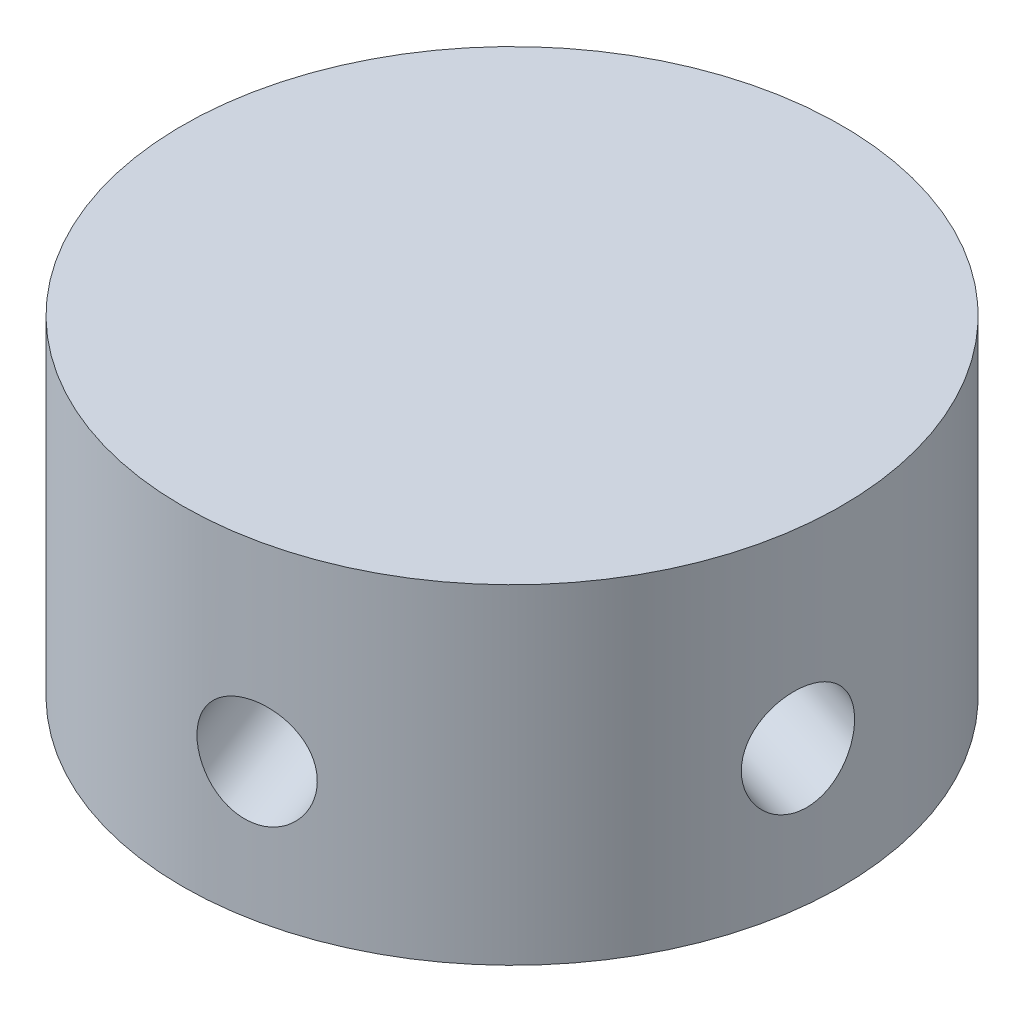
ISO-10303-21;
HEADER;
FILE_DESCRIPTION(('STEP AP214'),'2;1');
FILE_NAME('part.step','',(''),(''),'','','');
FILE_SCHEMA(('AUTOMOTIVE_DESIGN { 1 0 10303 214 1 1 1 1 }'));
ENDSEC;
DATA;
#1=APPLICATION_CONTEXT('core data for automotive mechanical design processes');
#2=APPLICATION_PROTOCOL_DEFINITION('international standard','automotive_design',2000,#1);
#3=PRODUCT_CONTEXT('',#1,'mechanical');
#4=PRODUCT('Part','Part','',(#3));
#5=PRODUCT_RELATED_PRODUCT_CATEGORY('part','',(#4));
#6=PRODUCT_DEFINITION_FORMATION('','',#4);
#7=PRODUCT_DEFINITION_CONTEXT('part definition',#1,'design');
#8=PRODUCT_DEFINITION('design','',#6,#7);
#9=PRODUCT_DEFINITION_SHAPE('','',#8);
#10=(LENGTH_UNIT() NAMED_UNIT(*) SI_UNIT(.MILLI.,.METRE.));
#11=(NAMED_UNIT(*) PLANE_ANGLE_UNIT() SI_UNIT($,.RADIAN.));
#12=(NAMED_UNIT(*) SI_UNIT($,.STERADIAN.) SOLID_ANGLE_UNIT());
#13=UNCERTAINTY_MEASURE_WITH_UNIT(LENGTH_MEASURE(1.E-05),#10,'distance_accuracy_value','');
#14=(GEOMETRIC_REPRESENTATION_CONTEXT(3) GLOBAL_UNCERTAINTY_ASSIGNED_CONTEXT((#13)) GLOBAL_UNIT_ASSIGNED_CONTEXT((#10,
#11,#12)) REPRESENTATION_CONTEXT('',''));
#15=CARTESIAN_POINT('',(0.,0.,0.));
#16=DIRECTION('',(0.,0.,1.));
#17=DIRECTION('',(1.,0.,0.));
#18=AXIS2_PLACEMENT_3D('',#15,#16,#17);
#19=CARTESIAN_POINT('',(0.,-7.,0.));
#20=DIRECTION('',(0.,1.,0.));
#21=DIRECTION('',(0.,0.,1.));
#22=AXIS2_PLACEMENT_3D('',#19,#20,#21);
#23=CYLINDRICAL_SURFACE('',#22,10.);
#24=CARTESIAN_POINT('',(-6.22013134397962,-2.80645798028636,-7.83006807528788));
#25=CARTESIAN_POINT('',(-6.2201352762451,-2.90151003833448,-7.83006658753266));
#26=CARTESIAN_POINT('',(-6.22657008205849,-2.99663277846063,-7.82496630875553));
#27=CARTESIAN_POINT('',(-6.25181548766981,-3.18423077392072,-7.80480955696079));
#28=CARTESIAN_POINT('',(-6.27064485695266,-3.27670179168825,-7.78973798391667));
#29=CARTESIAN_POINT('',(-6.31978124286163,-3.45624651146186,-7.7499264473174));
#30=CARTESIAN_POINT('',(-6.35007473497437,-3.54332643316753,-7.7251978752728));
#31=CARTESIAN_POINT('',(-6.42099844478036,-3.70974487952024,-7.66634817593697));
#32=CARTESIAN_POINT('',(-6.46162642580853,-3.78908507412121,-7.63222908088));
#33=CARTESIAN_POINT('',(-6.55209319703976,-3.93803047533096,-7.55470943878775));
#34=CARTESIAN_POINT('',(-6.6019802602762,-4.0075811381554,-7.51126005195026));
#35=CARTESIAN_POINT('',(-6.70913221844852,-4.13391794668991,-7.41570496412986));
#36=CARTESIAN_POINT('',(-6.76639522528258,-4.19070734886574,-7.36360147744792));
#37=CARTESIAN_POINT('',(-6.88310676845439,-4.28648546765869,-7.25457605743244));
#38=CARTESIAN_POINT('',(-6.94228547000598,-4.32624822721153,-7.19804726582894));
#39=CARTESIAN_POINT('',(-7.06330824195886,-4.39019806047503,-7.07932450961928));
#40=CARTESIAN_POINT('',(-7.12515051528809,-4.41439546555958,-7.01713433407035));
#41=CARTESIAN_POINT('',(-7.24411807181146,-4.44465367628386,-6.8941622092134));
#42=CARTESIAN_POINT('',(-7.30121785674374,-4.45202966509339,-6.83367720593518));
#43=CARTESIAN_POINT('',(-7.41387808455113,-4.45220918702201,-6.71128316470841));
#44=CARTESIAN_POINT('',(-7.46943892700586,-4.44501653946709,-6.64937450419361));
#45=CARTESIAN_POINT('',(-7.57519938628339,-4.41700129109492,-6.52859453386484));
#46=CARTESIAN_POINT('',(-7.62552486764564,-4.39674035228536,-6.46970145947388));
#47=CARTESIAN_POINT('',(-7.72210922674314,-4.34400062500404,-6.35410950713834));
#48=CARTESIAN_POINT('',(-7.76836765546333,-4.31152048958002,-6.29741087185239));
#49=CARTESIAN_POINT('',(-7.85740227269612,-4.23434398050499,-6.18599089333625));
#50=CARTESIAN_POINT('',(-7.90001908588631,-4.18928904297503,-6.13139138330953));
#51=CARTESIAN_POINT('',(-7.97948409889834,-4.08901176589896,-6.02761263062767));
#52=CARTESIAN_POINT('',(-8.01633046231996,-4.03378620174836,-5.97843511494736));
#53=CARTESIAN_POINT('',(-8.08648665739848,-3.91025447137792,-5.88323846843535));
#54=CARTESIAN_POINT('',(-8.1193173517223,-3.84127443124099,-5.83774055754514));
#55=CARTESIAN_POINT('',(-8.17769670397661,-3.69537115959263,-5.75567709528566));
#56=CARTESIAN_POINT('',(-8.20324273837802,-3.61844507991277,-5.71911476269039));
#57=CARTESIAN_POINT('',(-8.24832073838547,-3.45338283417414,-5.65392645042055));
#58=CARTESIAN_POINT('',(-8.2673519659217,-3.36484278335232,-5.6259733809365));
#59=CARTESIAN_POINT('',(-8.29678950866714,-3.18337676487274,-5.58247063293855));
#60=CARTESIAN_POINT('',(-8.30719471613756,-3.09045023552992,-5.56692254746119));
#61=CARTESIAN_POINT('',(-8.31925073084386,-2.90151204710584,-5.54889105123267));
#62=CARTESIAN_POINT('',(-8.32078412831005,-2.80547585312512,-5.54658286101772));
#63=CARTESIAN_POINT('',(-8.3145592914841,-2.61438001056549,-5.55591007180539));
#64=CARTESIAN_POINT('',(-8.30680294989611,-2.51932016704288,-5.56754263250066));
#65=CARTESIAN_POINT('',(-8.28227374460519,-2.33634137431789,-5.60396288366444));
#66=CARTESIAN_POINT('',(-8.26581391013902,-2.24828970765452,-5.62829350390981));
#67=CARTESIAN_POINT('',(-8.22408893209451,-2.07870042040506,-5.68908712441134));
#68=CARTESIAN_POINT('',(-8.19882589179631,-1.99716124955495,-5.72554722657247));
#69=CARTESIAN_POINT('',(-8.14092086706601,-1.84635871039586,-5.80756515112215));
#70=CARTESIAN_POINT('',(-8.10861793964204,-1.77673265719258,-5.85269628210322));
#71=CARTESIAN_POINT('',(-8.03655493536899,-1.64801243758575,-5.95126037867633));
#72=CARTESIAN_POINT('',(-7.99679573352392,-1.588917036981,-6.00469237002489));
#73=CARTESIAN_POINT('',(-7.91141926157434,-1.48410968518203,-6.11672248878328));
#74=CARTESIAN_POINT('',(-7.86594031068195,-1.43814598809001,-6.17519076167238));
#75=CARTESIAN_POINT('',(-7.76941944687581,-1.35927094067608,-6.29619750325789));
#76=CARTESIAN_POINT('',(-7.71837771274043,-1.32635917104508,-6.35873584112336));
#77=CARTESIAN_POINT('',(-7.61214134696524,-1.27459578732431,-6.4855307996219));
#78=CARTESIAN_POINT('',(-7.5569666067914,-1.25568106243582,-6.54977833753549));
#79=CARTESIAN_POINT('',(-7.44365112216401,-1.23216270872572,-6.67827774602823));
#80=CARTESIAN_POINT('',(-7.38551037226342,-1.2275591061873,-6.74252961661513));
#81=CARTESIAN_POINT('',(-7.26785233161192,-1.23278389564759,-6.86919185678924));
#82=CARTESIAN_POINT('',(-7.20833466663978,-1.24261625753787,-6.93160171500778));
#83=CARTESIAN_POINT('',(-7.08972094554958,-1.27646382126552,-7.05287559775));
#84=CARTESIAN_POINT('',(-7.03062488869562,-1.30047899834164,-7.11173962846402));
#85=CARTESIAN_POINT('',(-6.91475611783419,-1.36205630770563,-7.22445054125343));
#86=CARTESIAN_POINT('',(-6.85798331767067,-1.39961793712677,-7.27829760947341));
#87=CARTESIAN_POINT('',(-6.74869706990237,-1.48726990650302,-7.37974621751834));
#88=CARTESIAN_POINT('',(-6.69618336987258,-1.53735950324076,-7.42734812757985));
#89=CARTESIAN_POINT('',(-6.59729073435006,-1.6486613693767,-7.51532720971499));
#90=CARTESIAN_POINT('',(-6.55091018711487,-1.70987070652088,-7.5557062808794));
#91=CARTESIAN_POINT('',(-6.46593343456832,-1.84169641145246,-7.62855471978836));
#92=CARTESIAN_POINT('',(-6.42733879843957,-1.91231467077379,-7.66102249335326));
#93=CARTESIAN_POINT('',(-6.35911165279476,-2.06134518255373,-7.71775135269262));
#94=CARTESIAN_POINT('',(-6.32953237043657,-2.13980022639808,-7.74196379443863));
#95=CARTESIAN_POINT('',(-6.28063210406443,-2.30186553725353,-7.78168757924425));
#96=CARTESIAN_POINT('',(-6.26130157039589,-2.38547092385533,-7.79720702309411));
#97=CARTESIAN_POINT('',(-6.23826728195097,-2.52567502389065,-7.8156347503374));
#98=CARTESIAN_POINT('',(-6.23146113210476,-2.58146909076562,-7.82105665285393));
#99=CARTESIAN_POINT('',(-6.22239202005711,-2.69365313652901,-7.82827373777855));
#100=CARTESIAN_POINT('',(-6.22012901011905,-2.75004310914975,-7.83006895829368));
#101=CARTESIAN_POINT('',(-6.22013134397962,-2.80645798028636,-7.83006807528788));
#102=B_SPLINE_CURVE_WITH_KNOTS('',3,(#24,#25,#26,#27,#28,#29,#30,#31,#32,#33,#34,#35,#36,#37,
#38,#39,#40,#41,#42,#43,#44,#45,#46,#47,#48,#49,#50,#51,#52,#53,#54,#55,#56,#57,#58,#59,#60,#61,
#62,#63,#64,#65,#66,#67,#68,#69,#70,#71,#72,#73,#74,#75,#76,#77,#78,#79,#80,#81,#82,#83,#84,#85,
#86,#87,#88,#89,#90,#91,#92,#93,#94,#95,#96,#97,#98,#99,#100,#101),.UNSPECIFIED.,.T.,.F.,(4,2,2,
2,2,2,2,2,2,2,2,2,2,2,2,2,2,2,2,2,2,2,2,2,2,2,2,2,2,2,2,2,2,2,2,2,2,2,4),(0.,0.284945435825172,
0.570323369414488,0.855365679741571,1.14034635155516,1.42685680358444,1.7132940595777,
1.98478920108032,2.25610395350513,2.50534906718224,2.75452884700764,2.99365452287801,
3.23280656588999,3.47963280444375,3.72653743457989,3.99214017066535,4.25783844161293,
4.54086090995537,4.82391971793297,5.11071611487525,5.39745408946616,5.67451806408657,
5.95151588734594,6.21733139892979,6.48311573619654,6.74339760173988,7.00367110473335,
7.2627637971331,7.52185696537104,7.78102139760106,8.04018537736652,8.2993397375262,
8.55847872708714,8.81754948112769,9.07667239657495,9.33729680671825,9.59767794162213,
9.76679925560579,9.93591879255369),.UNSPECIFIED.);
#103=CARTESIAN_POINT('',(-6.22013134397962,-2.80645798028636,-7.83006807528788));
#104=VERTEX_POINT('',#103);
#105=EDGE_CURVE('E34',#104,#104,#102,.T.);
#106=ORIENTED_EDGE('',*,*,#105,.F.);
#107=EDGE_LOOP('',(#106));
#108=FACE_BOUND('',#107,.T.);
#109=CARTESIAN_POINT('',(5.52471097350322,-2.80645798028636,-8.33532054928022));
#110=CARTESIAN_POINT('',(5.52470834342707,-2.90151003833448,-8.33532382934528));
#111=CARTESIAN_POINT('',(5.51786922570932,-2.99663277846063,-8.33986762052701));
#112=CARTESIAN_POINT('',(5.49089775620381,-3.18423077392072,-8.35764864918421));
#113=CARTESIAN_POINT('',(5.47074524334762,-3.27670179168825,-8.37089907133579));
#114=CARTESIAN_POINT('',(5.41769824375312,-3.45624651146187,-8.40532810996036));
#115=CARTESIAN_POINT('',(5.38481877028962,-3.54332643316753,-8.42649738402711));
#116=CARTESIAN_POINT('',(5.3069327486201,-3.70974487952024,-8.47576428318929));
#117=CARTESIAN_POINT('',(5.26192882435123,-3.78908507412121,-8.50386040908475));
#118=CARTESIAN_POINT('',(5.16024749386185,-3.93803047533096,-8.56594453456803));
#119=CARTESIAN_POINT('',(5.10350872104151,-4.0075811381554,-8.59996335220992));
#120=CARTESIAN_POINT('',(4.97951865604896,-4.13391794668991,-8.672342774228));
#121=CARTESIAN_POINT('',(4.91227005325768,-4.19070734886575,-8.71070226716927));
#122=CARTESIAN_POINT('',(4.77251486683032,-4.2864854676587,-8.78801083322604));
#123=CARTESIAN_POINT('',(4.70046556673303,-4.32624822721153,-8.82682476568561));
#124=CARTESIAN_POINT('',(4.55015542256751,-4.39019806047503,-8.90523691228367));
#125=CARTESIAN_POINT('',(4.47189873743264,-4.41439546555958,-8.94483458818816));
#126=CARTESIAN_POINT('',(4.3181823000198,-4.44465367628386,-9.01997898163223));
#127=CARTESIAN_POINT('',(4.24301283959469,-4.45202966509339,-9.05559321025334));
#128=CARTESIAN_POINT('',(4.09179526414763,-4.45220918702201,-9.12491761528755));
#129=CARTESIAN_POINT('',(4.01574738460963,-4.44501653946709,-9.15862828835691));
#130=CARTESIAN_POINT('',(3.86819702754086,-4.41700129109493,-9.22188939890748));
#131=CARTESIAN_POINT('',(3.79663495638565,-4.39674035228536,-9.25155281505494));
#132=CARTESIAN_POINT('',(3.65685426853372,-4.34400062500404,-9.30769012146215));
#133=CARTESIAN_POINT('',(3.58863602137235,-4.31152048958002,-9.33416365966884));
#134=CARTESIAN_POINT('',(3.45515611494651,-4.23434398050499,-9.38440994568955));
#135=CARTESIAN_POINT('',(3.3900595756272,-4.18928904297503,-9.40806876709501));
#136=CARTESIAN_POINT('',(3.26680407715719,-4.08901176589896,-9.45157508730385));
#137=CARTESIAN_POINT('',(3.20864732793603,-4.03378620174836,-9.4714213732514));
#138=CARTESIAN_POINT('',(3.09643048040139,-3.91025447137792,-9.50872649815959));
#139=CARTESIAN_POINT('',(3.04301415328825,-3.84127443124099,-9.52589071625712));
#140=CARTESIAN_POINT('',(2.94692695078945,-3.69537115959263,-9.55605377518025));
#141=CARTESIAN_POINT('',(2.90425994735485,-3.61844507991277,-9.56905111553728));
#142=CARTESIAN_POINT('',(2.82833231010959,-3.45338283417414,-9.59177854485992));
#143=CARTESIAN_POINT('',(2.79586638849382,-3.36484278335232,-9.60124034430583));
#144=CARTESIAN_POINT('',(2.74539611555265,-3.18337676487274,-9.61579402272422));
#145=CARTESIAN_POINT('',(2.72739362160513,-3.09045023552992,-9.62088534044987));
#146=CARTESIAN_POINT('',(2.70651913618977,-2.90151204710584,-9.62677925302823));
#147=CARTESIAN_POINT('',(2.7038500709688,-2.80547585312512,-9.62752433067784));
#148=CARTESIAN_POINT('',(2.71464435593371,-2.61438001056549,-9.62448642569516));
#149=CARTESIAN_POINT('',(2.72810441994902,-2.51932016704288,-9.62070436542823));
#150=CARTESIAN_POINT('',(2.77032207843683,-2.33634137431788,-9.60863018144577));
#151=CARTESIAN_POINT('',(2.79854824194134,-2.24828970765452,-9.60049452375907));
#152=CARTESIAN_POINT('',(2.86926013817418,-2.07870042040506,-9.57959797338213));
#153=CARTESIAN_POINT('',(2.91174246470102,-1.99716124955495,-9.56683818546954));
#154=CARTESIAN_POINT('',(3.00763978299836,-1.84635871039586,-9.53711216690276));
#155=CARTESIAN_POINT('',(3.06054419274775,-1.77673265719258,-9.52033654372931));
#156=CARTESIAN_POINT('',(3.17655291205244,-1.64801243758575,-9.48225853480791));
#157=CARTESIAN_POINT('',(3.23965602465603,-1.588917036981,-9.46095668018047));
#158=CARTESIAN_POINT('',(3.37258577987471,-1.48410968518203,-9.41437804077272));
#159=CARTESIAN_POINT('',(3.4422461805145,-1.43814598809001,-9.38919267812672));
#160=CARTESIAN_POINT('',(3.58715701784289,-1.35927094067608,-9.33478902122931));
#161=CARTESIAN_POINT('',(3.66240727485831,-1.32635917104508,-9.30557085657725));
#162=CARTESIAN_POINT('',(3.81582528881689,-1.27459578732431,-9.24371586561636));
#163=CARTESIAN_POINT('',(3.89397826077947,-1.25568106243582,-9.21109515050118));
#164=CARTESIAN_POINT('',(4.05120487104226,-1.23216270872572,-9.14303422144055));
#165=CARTESIAN_POINT('',(4.13027851103306,-1.2275591061873,-9.10759400231703));
#166=CARTESIAN_POINT('',(4.28709979400537,-1.2327838956476,-9.0348353408203));
#167=CARTESIAN_POINT('',(4.36484706628707,-1.24261625753787,-8.99751638451994));
#168=CARTESIAN_POINT('',(4.5168390383084,-1.27646382126552,-8.92218372289627));
#169=CARTESIAN_POINT('',(4.59108374416279,-1.30047899834164,-8.884170018786));
#170=CARTESIAN_POINT('',(4.73408361154225,-1.36205630770563,-8.80880185672656));
#171=CARTESIAN_POINT('',(4.80283897672503,-1.39961793712677,-8.77144737435997));
#172=CARTESIAN_POINT('',(4.9330936442871,-1.48726990650303,-8.69885932022005));
#173=CARTESIAN_POINT('',(4.99459337678592,-1.53735950324076,-8.66362562278566));
#174=CARTESIAN_POINT('',(5.1088259611432,-1.6486613693767,-8.59676016888763));
#175=CARTESIAN_POINT('',(5.16156111720014,-1.70987070652088,-8.56512746641715));
#176=CARTESIAN_POINT('',(5.25710336039011,-1.84169641145247,-8.50682117781071));
#177=CARTESIAN_POINT('',(5.2999084464641,-1.91231467077379,-8.48014859142749));
#178=CARTESIAN_POINT('',(5.37494414528274,-2.06134518255373,-8.43279090158115));
#179=CARTESIAN_POINT('',(5.40711204671079,-2.13980022639808,-8.41214138832189));
#180=CARTESIAN_POINT('',(5.46000262444053,-2.30186553725354,-8.37790979592592));
#181=CARTESIAN_POINT('',(5.48073595605713,-2.38547092385533,-8.36432113780984));
#182=CARTESIAN_POINT('',(5.50537975271519,-2.52567502389066,-8.34810870857197));
#183=CARTESIAN_POINT('',(5.512639504403,-2.58146909076563,-8.3433111354293));
#184=CARTESIAN_POINT('',(5.52230586979583,-2.69365313652901,-8.33691609921093));
#185=CARTESIAN_POINT('',(5.52471253449422,-2.75004310914975,-8.33531860251071));
#186=CARTESIAN_POINT('',(5.52471097350322,-2.80645798028636,-8.33532054928022));
#187=B_SPLINE_CURVE_WITH_KNOTS('',3,(#109,#110,#111,#112,#113,#114,#115,#116,#117,#118,#119,
#120,#121,#122,#123,#124,#125,#126,#127,#128,#129,#130,#131,#132,#133,#134,#135,#136,#137,#138,
#139,#140,#141,#142,#143,#144,#145,#146,#147,#148,#149,#150,#151,#152,#153,#154,#155,#156,#157,
#158,#159,#160,#161,#162,#163,#164,#165,#166,#167,#168,#169,#170,#171,#172,#173,#174,#175,#176,
#177,#178,#179,#180,#181,#182,#183,#184,#185,#186),.UNSPECIFIED.,.T.,.F.,(4,2,2,2,2,2,2,2,2,2,2,
2,2,2,2,2,2,2,2,2,2,2,2,2,2,2,2,2,2,2,2,2,2,2,2,2,2,2,4),(0.,0.284945435825173,0.57032336941449,
0.855365679741574,1.14034635155516,1.42685680358444,1.7132940595777,1.98478920108033,
2.25610395350513,2.50534906718224,2.75452884700764,2.99365452287801,3.23280656588999,
3.47963280444375,3.7265374345799,3.99214017066535,4.25783844161293,4.54086090995537,
4.82391971793297,5.11071611487525,5.39745408946617,5.67451806408657,5.95151588734594,
6.21733139892979,6.48311573619654,6.74339760173988,7.00367110473336,7.26276379713311,
7.52185696537105,7.78102139760106,8.04018537736652,8.29933973752621,8.55847872708715,
8.81754948112769,9.07667239657495,9.33729680671825,9.59767794162213,9.76679925560579,
9.93591879255369),.UNSPECIFIED.);
#188=CARTESIAN_POINT('',(5.52471097350322,-2.80645798028636,-8.33532054928022));
#189=VERTEX_POINT('',#188);
#190=EDGE_CURVE('E91',#189,#189,#187,.T.);
#191=ORIENTED_EDGE('',*,*,#190,.F.);
#192=EDGE_LOOP('',(#191));
#193=FACE_BOUND('',#192,.T.);
#194=CARTESIAN_POINT('',(9.92754366277526,-4.45127628870084,1.2016142574432));
#195=CARTESIAN_POINT('',(9.9373455034434,-4.45407536300653,1.12062206863284));
#196=CARTESIAN_POINT('',(9.94618270820029,-4.44986952553911,1.03922106184134));
#197=CARTESIAN_POINT('',(9.96170408268497,-4.42761604145914,0.878080051319155));
#198=CARTESIAN_POINT('',(9.96838614640058,-4.40955491326582,0.798341743108557));
#199=CARTESIAN_POINT('',(9.9796073985255,-4.36046095337173,0.643030361954135));
#200=CARTESIAN_POINT('',(9.9841515604486,-4.32945854822245,0.56744798656449));
#201=CARTESIAN_POINT('',(9.99135001069086,-4.25574143353925,0.422166575811908));
#202=CARTESIAN_POINT('',(9.994004248926,-4.21302641365618,0.35246769640798));
#203=CARTESIAN_POINT('',(9.99786112412804,-4.11550568478299,0.217905756338075));
#204=CARTESIAN_POINT('',(9.9990035236122,-4.06029558799352,0.153334755876271));
#205=CARTESIAN_POINT('',(10.0001239016559,-3.94056793509763,0.0334866405890783));
#206=CARTESIAN_POINT('',(10.0001014938858,-3.87604729805529,-0.0217873846258331));
#207=CARTESIAN_POINT('',(9.9993533016998,-3.73403867385064,-0.125943473326513));
#208=CARTESIAN_POINT('',(9.9985722762101,-3.65592968023283,-0.17397961906799));
#209=CARTESIAN_POINT('',(9.99678465735068,-3.49302892990983,-0.256950889052139));
#210=CARTESIAN_POINT('',(9.99577799325239,-3.40823508318833,-0.291881896164258));
#211=CARTESIAN_POINT('',(9.99395010570144,-3.23009705167691,-0.349033820215749));
#212=CARTESIAN_POINT('',(9.99313962674803,-3.13653875639819,-0.370591343162304));
#213=CARTESIAN_POINT('',(9.99210418254623,-2.94710826479143,-0.397542686704983));
#214=CARTESIAN_POINT('',(9.9918791981911,-2.85123614407468,-0.40293703476309));
#215=CARTESIAN_POINT('',(9.99211375809722,-2.66095103797873,-0.397078911025858));
#216=CARTESIAN_POINT('',(9.99256642667176,-2.5665330846907,-0.385993654547043));
#217=CARTESIAN_POINT('',(9.99398157772861,-2.38110880881209,-0.347422255715869));
#218=CARTESIAN_POINT('',(9.9949439292352,-2.29010161617211,-0.319940326667134));
#219=CARTESIAN_POINT('',(9.99691655701697,-2.1181396711715,-0.25060100869463));
#220=CARTESIAN_POINT('',(9.9979231669724,-2.03692409068805,-0.209390140520527));
#221=CARTESIAN_POINT('',(9.9994708150246,-1.88289901049117,-0.113462696072192));
#222=CARTESIAN_POINT('',(10.0000119415511,-1.8100879164209,-0.0587486875855351));
#223=CARTESIAN_POINT('',(9.99998809794213,-1.67741893039717,0.0605458585721596));
#224=CARTESIAN_POINT('',(9.99945940571072,-1.61721009611755,0.124736601549652));
#225=CARTESIAN_POINT('',(9.99679413809161,-1.5085371202084,0.262360569195701));
#226=CARTESIAN_POINT('',(9.99465768255667,-1.46007210347707,0.335793104583318));
#227=CARTESIAN_POINT('',(9.98833832092572,-1.37678714985159,0.488750289898697));
#228=CARTESIAN_POINT('',(9.98418128821917,-1.34180446528352,0.568187469570253));
#229=CARTESIAN_POINT('',(9.97353552564428,-1.28557478771544,0.731635433297488));
#230=CARTESIAN_POINT('',(9.96704682382246,-1.26432762950616,0.815646162329882));
#231=CARTESIAN_POINT('',(9.95166711371533,-1.23615040961426,0.985696419119057));
#232=CARTESIAN_POINT('',(9.94277953027157,-1.22920005765546,1.07173289613044));
#233=CARTESIAN_POINT('',(9.92276093815355,-1.22973605202921,1.24349968340963));
#234=CARTESIAN_POINT('',(9.91162992532428,-1.23722242510008,1.32922999311009));
#235=CARTESIAN_POINT('',(9.88753144472138,-1.26644305596626,1.4979963943803));
#236=CARTESIAN_POINT('',(9.87456326245353,-1.2881828690628,1.58103142221099));
#237=CARTESIAN_POINT('',(9.84743396360787,-1.34534244844275,1.74204327093094));
#238=CARTESIAN_POINT('',(9.8332728619055,-1.38076204416216,1.82002015487264));
#239=CARTESIAN_POINT('',(9.8045839610671,-1.46431105744408,1.96872362050771));
#240=CARTESIAN_POINT('',(9.79005630359445,-1.51243563093136,2.03945295126627));
#241=CARTESIAN_POINT('',(9.76155827967071,-1.6200682506405,2.17176625377687));
#242=CARTESIAN_POINT('',(9.74758789798334,-1.67957598538107,2.23335047568773));
#243=CARTESIAN_POINT('',(9.72113555680129,-1.80835838854015,2.34582052627));
#244=CARTESIAN_POINT('',(9.70865518726968,-1.87764332106085,2.39669497014197));
#245=CARTESIAN_POINT('',(9.68606356901538,-2.02394031509152,2.4864274304408));
#246=CARTESIAN_POINT('',(9.6759523654078,-2.10095252370918,2.52528521804357));
#247=CARTESIAN_POINT('',(9.65869088641241,-2.26138104729476,2.5905305142629));
#248=CARTESIAN_POINT('',(9.65157405964452,-2.34485797737449,2.61677759237273));
#249=CARTESIAN_POINT('',(9.64091531599557,-2.51511912408653,2.65577906497512));
#250=CARTESIAN_POINT('',(9.63737390925131,-2.60190381083312,2.66853153408496));
#251=CARTESIAN_POINT('',(9.63399128147151,-2.77908994056845,2.68071924199657));
#252=CARTESIAN_POINT('',(9.63426445488372,-2.86952169785422,2.67974276103603));
#253=CARTESIAN_POINT('',(9.63868514865938,-3.04904623082048,2.66379666344249));
#254=CARTESIAN_POINT('',(9.64283358645096,-3.1381386843599,2.6488237332966));
#255=CARTESIAN_POINT('',(9.65489808382536,-3.31641651236098,2.60451360520813));
#256=CARTESIAN_POINT('',(9.66296512559141,-3.40544850087679,2.57459929060658));
#257=CARTESIAN_POINT('',(9.682289602647,-3.57724239033872,2.50094201045493));
#258=CARTESIAN_POINT('',(9.69354772017035,-3.66000294568781,2.45719608755458));
#259=CARTESIAN_POINT('',(9.71870347725996,-3.81854828668254,2.35575564596313));
#260=CARTESIAN_POINT('',(9.73265108650513,-3.89415246659859,2.29779026719062));
#261=CARTESIAN_POINT('',(9.76202153202834,-4.03388993998306,2.16961832131643));
#262=CARTESIAN_POINT('',(9.77744448141327,-4.09802235288553,2.09941081533256));
#263=CARTESIAN_POINT('',(9.80809212031176,-4.21022813077123,1.95111555025876));
#264=CARTESIAN_POINT('',(9.82330434731951,-4.25879158835694,1.87339693595189));
#265=CARTESIAN_POINT('',(9.85301359987109,-4.34063885577796,1.71024816924082));
#266=CARTESIAN_POINT('',(9.8675118998754,-4.37395084471423,1.62483259047612));
#267=CARTESIAN_POINT('',(9.88965675929384,-4.41419918242897,1.48248153334471));
#268=CARTESIAN_POINT('',(9.89781419513009,-4.42634782652209,1.42705089635986));
#269=CARTESIAN_POINT('',(9.91332042844276,-4.44390459215839,1.31501856434286));
#270=CARTESIAN_POINT('',(9.92066928405041,-4.44931319855199,1.25841695384352));
#271=CARTESIAN_POINT('',(9.92754366277526,-4.45127628870084,1.2016142574432));
#272=B_SPLINE_CURVE_WITH_KNOTS('',3,(#194,#195,#196,#197,#198,#199,#200,#201,#202,#203,#204,
#205,#206,#207,#208,#209,#210,#211,#212,#213,#214,#215,#216,#217,#218,#219,#220,#221,#222,#223,
#224,#225,#226,#227,#228,#229,#230,#231,#232,#233,#234,#235,#236,#237,#238,#239,#240,#241,#242,
#243,#244,#245,#246,#247,#248,#249,#250,#251,#252,#253,#254,#255,#256,#257,#258,#259,#260,#261,
#262,#263,#264,#265,#266,#267,#268,#269,#270,#271),.UNSPECIFIED.,.T.,.F.,(4,2,2,2,2,2,2,2,2,2,2,
2,2,2,2,2,2,2,2,2,2,2,2,2,2,2,2,2,2,2,2,2,2,2,2,2,2,2,4),(0.,0.244675291413805,
0.489588961095033,0.733930022951285,0.978277559738612,1.23209392169861,1.48599446704816,
1.75988573539894,2.03386297794244,2.32052597796234,2.60717962304532,2.89094443251172,
3.17463635690425,3.44651065156617,3.71833328578263,3.98109281137689,4.24383275116873,
4.50329357981316,4.76275128763554,5.0218405137936,5.28093021981237,5.54012096653909,
5.79930848169531,6.05839731780294,6.31747906538914,6.57683484883207,6.83619557068681,
7.09838113867629,7.36060410971514,7.63070728096977,7.9008744125225,8.18239329771737,
8.46397241550192,8.75140038249062,9.03885040281866,9.31607547103774,9.59278624154469,
9.76439805261911,9.9359975179377),.UNSPECIFIED.);
#273=CARTESIAN_POINT('',(9.92754366277526,-4.45127628870084,1.2016142574432));
#274=VERTEX_POINT('',#273);
#275=EDGE_CURVE('E95',#274,#274,#272,.T.);
#276=ORIENTED_EDGE('',*,*,#275,.F.);
#277=EDGE_LOOP('',(#276));
#278=FACE_BOUND('',#277,.T.);
#279=CARTESIAN_POINT('',(1.8896454515772,-1.23178939716607,9.81983910597998));
#280=CARTESIAN_POINT('',(1.8049224410845,-1.23651701061969,9.83614104204284));
#281=CARTESIAN_POINT('',(1.72032283580295,-1.24844535108957,9.85127334573821));
#282=CARTESIAN_POINT('',(1.55384406065938,-1.28641887209271,9.87890230412726));
#283=CARTESIAN_POINT('',(1.47196769565924,-1.31247815669328,9.89139630819936));
#284=CARTESIAN_POINT('',(1.31341211109878,-1.37801718615914,9.91369544446872));
#285=CARTESIAN_POINT('',(1.23673094287222,-1.41749186524381,9.92350158910594));
#286=CARTESIAN_POINT('',(1.09082125228229,-1.50878187616075,9.94059921550214));
#287=CARTESIAN_POINT('',(1.02159101598207,-1.56059436108186,9.94789127642951));
#288=CARTESIAN_POINT('',(0.892598469052778,-1.67512260876926,9.96029494472625));
#289=CARTESIAN_POINT('',(0.832836593282138,-1.73783887204188,9.96540645196642));
#290=CARTESIAN_POINT('',(0.724502051079656,-1.87238632353073,9.97386876962386));
#291=CARTESIAN_POINT('',(0.675929663523708,-1.94421773885494,9.97721953616082));
#292=CARTESIAN_POINT('',(0.591014568799021,-2.09540236716478,9.98261143712897));
#293=CARTESIAN_POINT('',(0.55474939295433,-2.17479937149384,9.98464433986631));
#294=CARTESIAN_POINT('',(0.495705671081713,-2.33846829509977,9.98775021294477));
#295=CARTESIAN_POINT('',(0.472928395227653,-2.42274067267715,9.98882309288411));
#296=CARTESIAN_POINT('',(0.440856012894253,-2.59581796380364,9.99029096066446));
#297=CARTESIAN_POINT('',(0.431883225346722,-2.68468255369959,9.9906697804316));
#298=CARTESIAN_POINT('',(0.428352570846424,-2.86269408262138,9.99082151480355));
#299=CARTESIAN_POINT('',(0.433797736559293,-2.95184107710889,9.99059430193567));
#300=CARTESIAN_POINT('',(0.459184049568461,-3.13171765961292,9.9894603474635));
#301=CARTESIAN_POINT('',(0.479701843936608,-3.22236572351145,9.98852652860047));
#302=CARTESIAN_POINT('',(0.535127263490573,-3.39914666425061,9.98570992440926));
#303=CARTESIAN_POINT('',(0.570038653197188,-3.48527835322453,9.98382689079344));
#304=CARTESIAN_POINT('',(0.65467645807969,-3.65349137821528,9.97863975401442));
#305=CARTESIAN_POINT('',(0.704854054553369,-3.73534501858842,9.97529077467231));
#306=CARTESIAN_POINT('',(0.818287865935779,-3.88934247526373,9.96662585059483));
#307=CARTESIAN_POINT('',(0.88154474231612,-3.96148580017156,9.96130980636636));
#308=CARTESIAN_POINT('',(1.01856345927741,-4.09260592867898,9.94822534828571));
#309=CARTESIAN_POINT('',(1.09216157703068,-4.15175677141243,9.94049321018104));
#310=CARTESIAN_POINT('',(1.24853077068113,-4.25575861619386,9.92206350750152));
#311=CARTESIAN_POINT('',(1.33129684888506,-4.30061735804011,9.91136755385071));
#312=CARTESIAN_POINT('',(1.4972962855027,-4.37126571860007,9.88759956815453));
#313=CARTESIAN_POINT('',(1.58008200369985,-4.39818023672969,9.87474927532669));
#314=CARTESIAN_POINT('',(1.74870884055662,-4.43645160445845,9.84628395165593));
#315=CARTESIAN_POINT('',(1.83454824151407,-4.44781706278205,9.83067045607044));
#316=CARTESIAN_POINT('',(2.00005358164592,-4.45416213523975,9.79828438539122));
#317=CARTESIAN_POINT('',(2.07971093385218,-4.45028152767424,9.78168060450511));
#318=CARTESIAN_POINT('',(2.2368139621995,-4.42885216578776,9.74695510878742));
#319=CARTESIAN_POINT('',(2.31425983761786,-4.41130464705395,9.72883353130774));
#320=CARTESIAN_POINT('',(2.46389431803177,-4.36362610927373,9.69201206133302));
#321=CARTESIAN_POINT('',(2.53613585774615,-4.33365247188225,9.67332201977927));
#322=CARTESIAN_POINT('',(2.67473776285083,-4.26231776034835,9.63591919044987));
#323=CARTESIAN_POINT('',(2.74109692543485,-4.22095436433864,9.61720639881169));
#324=CARTESIAN_POINT('',(2.87006804509127,-4.12570031123132,9.57953397538048));
#325=CARTESIAN_POINT('',(2.93227745902669,-4.07124889029414,9.56061667129666));
#326=CARTESIAN_POINT('',(3.04759418148476,-3.9529579002882,9.52448576933459));
#327=CARTESIAN_POINT('',(3.10069820360784,-3.88911495692885,9.50727278753876));
#328=CARTESIAN_POINT('',(3.20071915965419,-3.74845607046351,9.47409059586229));
#329=CARTESIAN_POINT('',(3.24682661947535,-3.67101586843882,9.45832415488298));
#330=CARTESIAN_POINT('',(3.32661687168422,-3.50934619803446,9.430557248521));
#331=CARTESIAN_POINT('',(3.36029587525779,-3.42511466883871,9.41855793171204));
#332=CARTESIAN_POINT('',(3.41581067243429,-3.24785076951386,9.39857210310521));
#333=CARTESIAN_POINT('',(3.43700037944504,-3.15459002770069,9.39080585788554));
#334=CARTESIAN_POINT('',(3.46424550664557,-2.96558275100997,9.3807898447801));
#335=CARTESIAN_POINT('',(3.47030113722518,-2.86983625070746,9.37854000020682));
#336=CARTESIAN_POINT('',(3.46681841068905,-2.67945287145242,9.37982806212942));
#337=CARTESIAN_POINT('',(3.45741081784239,-2.58481343407711,9.38331743527158));
#338=CARTESIAN_POINT('',(3.42311490244461,-2.39876144469994,9.39588291616313));
#339=CARTESIAN_POINT('',(3.39823053441214,-2.30734807469881,9.40495759678719));
#340=CARTESIAN_POINT('',(3.33468191552686,-2.13438905178565,9.42767081457229));
#341=CARTESIAN_POINT('',(3.29662946143017,-2.05259174955801,9.44110530447099));
#342=CARTESIAN_POINT('',(3.20743043026183,-1.89727096492838,9.47177932367676));
#343=CARTESIAN_POINT('',(3.15628681267182,-1.82374561791013,9.48901799286268));
#344=CARTESIAN_POINT('',(3.04416331749646,-1.68961803572301,9.52556649050772));
#345=CARTESIAN_POINT('',(2.98357802577791,-1.62866079710799,9.54478572046136));
#346=CARTESIAN_POINT('',(2.85297808066438,-1.51839161882392,9.58463175146228));
#347=CARTESIAN_POINT('',(2.78296220477843,-1.46908119122212,9.60525873482598));
#348=CARTESIAN_POINT('',(2.63637450166631,-1.38407014158452,9.64651496693262));
#349=CARTESIAN_POINT('',(2.55989685479844,-1.34820518177494,9.66714088350132));
#350=CARTESIAN_POINT('',(2.4017756008636,-1.29020766685392,9.70763154075728));
#351=CARTESIAN_POINT('',(2.32013734362141,-1.26806113949345,9.72749703651687));
#352=CARTESIAN_POINT('',(2.1800310051165,-1.24273794197792,9.75965720817587));
#353=CARTESIAN_POINT('',(2.12231194850046,-1.23579278222335,9.77237477815823));
#354=CARTESIAN_POINT('',(2.00625761647304,-1.22869255508036,9.79685906855147));
#355=CARTESIAN_POINT('',(1.94792234003501,-1.22853749900635,9.8086257873779));
#356=CARTESIAN_POINT('',(1.8896454515772,-1.23178939716607,9.81983910597998));
#357=B_SPLINE_CURVE_WITH_KNOTS('',3,(#279,#280,#281,#282,#283,#284,#285,#286,#287,#288,#289,
#290,#291,#292,#293,#294,#295,#296,#297,#298,#299,#300,#301,#302,#303,#304,#305,#306,#307,#308,
#309,#310,#311,#312,#313,#314,#315,#316,#317,#318,#319,#320,#321,#322,#323,#324,#325,#326,#327,
#328,#329,#330,#331,#332,#333,#334,#335,#336,#337,#338,#339,#340,#341,#342,#343,#344,#345,#346,
#347,#348,#349,#350,#351,#352,#353,#354,#355,#356),.UNSPECIFIED.,.T.,.F.,(4,2,2,2,2,2,2,2,2,2,2,
2,2,2,2,2,2,2,2,2,2,2,2,2,2,2,2,2,2,2,2,2,2,2,2,2,2,2,4),(0.,0.259004062941271,
0.518267114426859,0.777432374295099,1.03653789041825,1.29565530317051,1.55477917321403,
1.81550638382002,2.07625814355858,2.343010421399,2.60981881224736,2.88740430312338,
3.16506244019322,3.45189004214842,3.73873215367484,4.02145923157539,4.3040329391091,
4.56660784399177,4.8290373155784,5.07223496288582,5.31541062592722,5.55559616556476,
5.79583070469052,6.04918463754378,6.30262982155655,6.5759101539204,6.84927372708995,
7.1357590435013,7.42224037724935,7.70631153134168,7.99031013133837,8.26257523874826,
8.53477885024542,8.79770646644806,9.06066819894054,9.32030209324672,9.57967111326786,
9.75782726762585,9.93598371884699),.UNSPECIFIED.);
#358=CARTESIAN_POINT('',(1.8896454515772,-1.23178939716607,9.81983910597998));
#359=VERTEX_POINT('',#358);
#360=EDGE_CURVE('E58',#359,#359,#357,.T.);
#361=ORIENTED_EDGE('',*,*,#360,.F.);
#362=EDGE_LOOP('',(#361));
#363=FACE_BOUND('',#362,.T.);
#364=CARTESIAN_POINT('',(-9.36896355857115,-2.80645798028636,3.49607234452688));
#365=CARTESIAN_POINT('',(-9.36896335876872,-2.90151003833448,3.49607654407524));
#366=CARTESIAN_POINT('',(-9.36610116975465,-2.99663277846063,3.50377248089334));
#367=CARTESIAN_POINT('',(-9.35473221897671,-3.18423077392072,3.53401106726247));
#368=CARTESIAN_POINT('',(-9.34621689632405,-3.27670179168826,3.55657623381925));
#369=CARTESIAN_POINT('',(-9.32353785330562,-3.45624651146187,3.61561015520652));
#370=CARTESIAN_POINT('',(-9.30938078760573,-3.54332643316753,3.65206252729009));
#371=CARTESIAN_POINT('',(-9.27532802920454,-3.70974487952024,3.73770054086953));
#372=CARTESIAN_POINT('',(-9.25543357810537,-3.78908507412121,3.78688342717558));
#373=CARTESIAN_POINT('',(-9.20966378708935,-3.93803047533097,3.8968773262676));
#374=CARTESIAN_POINT('',(-9.18375691494804,-4.0075811381554,3.9577493417654));
#375=CARTESIAN_POINT('',(-9.1259904020671,-4.13391794668991,4.08918505585446));
#376=CARTESIAN_POINT('',(-9.09413228379728,-4.19070734886575,4.15974627449756));
#377=CARTESIAN_POINT('',(-9.02650879792955,-4.2864854676587,4.30443625576162));
#378=CARTESIAN_POINT('',(-8.99103394680123,-4.32624822721153,4.37818690277511));
#379=CARTESIAN_POINT('',(-8.91551998911531,-4.39019806047503,4.52997374794881));
#380=CARTESIAN_POINT('',(-8.87548393083947,-4.41439546555958,4.60800706610887));
#381=CARTESIAN_POINT('',(-8.7952934869166,-4.44465367628386,4.75915241238333));
#382=CARTESIAN_POINT('',(-8.75541363432994,-4.45202966509339,4.83214842884002));
#383=CARTESIAN_POINT('',(-8.67382390884815,-4.45220918702201,4.97711651137283));
#384=CARTESIAN_POINT('',(-8.63211451839076,-4.44501653946709,5.04908884083832));
#385=CARTESIAN_POINT('',(-8.5499277198213,-4.41700129109493,5.18699607821227));
#386=CARTESIAN_POINT('',(-8.50946850664816,-4.39674035228536,5.25305741603532));
#387=CARTESIAN_POINT('',(-8.4293802355001,-4.34400062500404,5.38063447781185));
#388=CARTESIAN_POINT('',(-8.38975126955398,-4.31152048958002,5.44214969974099));
#389=CARTESIAN_POINT('',(-8.31129778275334,-4.23434398050499,5.56125731951045));
#390=CARTESIAN_POINT('',(-8.27253988247777,-4.18928904297503,5.61866049388152));
#391=CARTESIAN_POINT('',(-8.19839646296565,-4.08901176589896,5.72630561055783));
#392=CARTESIAN_POINT('',(-8.16301201870088,-4.03378620174836,5.77654527267809));
#393=CARTESIAN_POINT('',(-8.09415408424613,-3.91025447137792,5.87268516074571));
#394=CARTESIAN_POINT('',(-8.06102824209937,-3.84127443124099,5.9179686341905));
#395=CARTESIAN_POINT('',(-8.00102146353494,-3.69537115959263,5.99884970202448));
#396=CARTESIAN_POINT('',(-7.97414277763818,-3.61844507991277,6.03444380663336));
#397=CARTESIAN_POINT('',(-7.92607487654239,-3.45338283417414,6.097459828608));
#398=CARTESIAN_POINT('',(-7.90537090039165,-3.36484278335232,6.12419757508494));
#399=CARTESIAN_POINT('',(-7.87309402941244,-3.18337676487273,6.16563743037009));
#400=CARTESIAN_POINT('',(-7.86152230734163,-3.09045023552992,6.18033799338073));
#401=CARTESIAN_POINT('',(-7.84809884878363,-2.90151204710584,6.19737598349633));
#402=CARTESIAN_POINT('',(-7.84637747531504,-2.80547585312512,6.19954760115129));
#403=CARTESIAN_POINT('',(-7.85332459954708,-2.61438001056549,6.19074516288159));
#404=CARTESIAN_POINT('',(-7.86199098083266,-2.51932016704288,6.17977378472878));
#405=CARTESIAN_POINT('',(-7.88904875673366,-2.33634137431788,6.14519064764831));
#406=CARTESIAN_POINT('',(-7.90710218308888,-2.24828970765452,6.12201783968261));
#407=CARTESIAN_POINT('',(-7.95202662471037,-2.07870042040506,6.06354876553655));
#408=CARTESIAN_POINT('',(-7.97889553367377,-1.99716124955495,6.02825539525509));
#409=CARTESIAN_POINT('',(-8.03900557856838,-1.84635871039586,5.94783951162989));
#410=CARTESIAN_POINT('',(-8.07194568123363,-1.77673265719258,5.90317131555941));
#411=CARTESIAN_POINT('',(-8.14341701456614,-1.64801243758575,5.8041773448854));
#412=CARTESIAN_POINT('',(-8.18194758906391,-1.588917036981,5.74985270351795));
#413=CARTESIAN_POINT('',(-8.26211178277821,-1.48410968518203,5.63403564295384));
#414=CARTESIAN_POINT('',(-8.30366464599381,-1.43814598809001,5.57271490039887));
#415=CARTESIAN_POINT('',(-8.38892230886651,-1.35927094067608,5.44352496433374));
#416=CARTESIAN_POINT('',(-8.43262703934153,-1.32635917104508,5.37565598128089));
#417=CARTESIAN_POINT('',(-8.52038736840978,-1.27459578732431,5.23543739636577));
#418=CARTESIAN_POINT('',(-8.56444047562448,-1.25568106243582,5.1631095191265));
#419=CARTESIAN_POINT('',(-8.65163426493588,-1.23216270872572,5.0156315880831));
#420=CARTESIAN_POINT('',(-8.69477494535671,-1.2275591061873,4.94048152909612));
#421=CARTESIAN_POINT('',(-8.77887956015667,-1.2327838956476,4.78944129808059));
#422=CARTESIAN_POINT('',(-8.81984289255456,-1.24261625753787,4.71355092816811));
#423=CARTESIAN_POINT('',(-8.89852755341004,-1.27646382126553,4.56326688506207));
#424=CARTESIAN_POINT('',(-8.93624888752759,-1.30047899834164,4.48887320925573));
#425=CARTESIAN_POINT('',(-9.00763791628001,-1.36205630770563,4.34384587218941));
#426=CARTESIAN_POINT('',(-9.04130576132523,-1.39961793712677,4.27321207146833));
#427=CARTESIAN_POINT('',(-9.10401781326356,-1.48726990650303,4.13792532944528));
#428=CARTESIAN_POINT('',(-9.13306229426895,-1.53735950324076,4.07327203366346));
#429=CARTESIAN_POINT('',(-9.18617586863625,-1.6486613693767,3.9520325167069));
#430=CARTESIAN_POINT('',(-9.21024627008503,-1.70987070652088,3.89544417582266));
#431=CARTESIAN_POINT('',(-9.25326999194765,-1.84169641145247,3.79211507594311));
#432=CARTESIAN_POINT('',(-9.27222228111064,-1.91231467077379,3.74537630195776));
#433=CARTESIAN_POINT('',(-9.30509128496539,-2.06134518255373,3.66295824889667));
#434=CARTESIAN_POINT('',(-9.31897818453325,-2.13980022639808,3.62734462368775));
#435=CARTESIAN_POINT('',(-9.34164673558608,-2.30186553725354,3.56856238212013));
#436=CARTESIAN_POINT('',(-9.35043314037485,-2.38547092385534,3.54538218021834));
#437=CARTESIAN_POINT('',(-9.36084096386728,-2.52567502389066,3.5177807892087));
#438=CARTESIAN_POINT('',(-9.3638942836176,-2.58146909076563,3.50963229602712));
#439=CARTESIAN_POINT('',(-9.36795562951721,-2.69365313652901,3.49877685602564));
#440=CARTESIAN_POINT('',(-9.368963677157,-2.75004310914975,3.49606985202978));
#441=CARTESIAN_POINT('',(-9.36896355857115,-2.80645798028636,3.49607234452688));
#442=B_SPLINE_CURVE_WITH_KNOTS('',3,(#364,#365,#366,#367,#368,#369,#370,#371,#372,#373,#374,
#375,#376,#377,#378,#379,#380,#381,#382,#383,#384,#385,#386,#387,#388,#389,#390,#391,#392,#393,
#394,#395,#396,#397,#398,#399,#400,#401,#402,#403,#404,#405,#406,#407,#408,#409,#410,#411,#412,
#413,#414,#415,#416,#417,#418,#419,#420,#421,#422,#423,#424,#425,#426,#427,#428,#429,#430,#431,
#432,#433,#434,#435,#436,#437,#438,#439,#440,#441),.UNSPECIFIED.,.T.,.F.,(4,2,2,2,2,2,2,2,2,2,2,
2,2,2,2,2,2,2,2,2,2,2,2,2,2,2,2,2,2,2,2,2,2,2,2,2,2,2,4),(0.,0.284945435825174,0.57032336941449,
0.855365679741575,1.14034635155517,1.42685680358445,1.7132940595777,1.98478920108033,
2.25610395350513,2.50534906718224,2.75452884700764,2.99365452287801,3.23280656588999,
3.47963280444376,3.7265374345799,3.99214017066536,4.25783844161294,4.54086090995538,
4.82391971793297,5.11071611487526,5.39745408946617,5.67451806408658,5.95151588734595,
6.21733139892979,6.48311573619655,6.74339760173989,7.00367110473336,7.26276379713311,
7.52185696537105,7.78102139760107,8.04018537736652,8.29933973752621,8.55847872708715,
8.8175494811277,9.07667239657495,9.33729680671825,9.59767794162214,9.76679925560579,
9.9359187925537),.UNSPECIFIED.);
#443=CARTESIAN_POINT('',(-9.36896355857115,-2.80645798028636,3.49607234452688));
#444=VERTEX_POINT('',#443);
#445=EDGE_CURVE('E47',#444,#444,#442,.T.);
#446=ORIENTED_EDGE('',*,*,#445,.F.);
#447=EDGE_LOOP('',(#446));
#448=FACE_BOUND('',#447,.T.);
#449=CARTESIAN_POINT('',(0.,-7.,0.));
#450=DIRECTION('',(0.,1.,0.));
#451=DIRECTION('',(0.,0.,1.));
#452=AXIS2_PLACEMENT_3D('',#449,#450,#451);
#453=CIRCLE('',#452,10.);
#454=CARTESIAN_POINT('',(0.,-7.,10.));
#455=VERTEX_POINT('',#454);
#456=EDGE_CURVE('E10',#455,#455,#453,.T.);
#457=ORIENTED_EDGE('',*,*,#456,.T.);
#458=EDGE_LOOP('',(#457));
#459=FACE_BOUND('',#458,.T.);
#460=CARTESIAN_POINT('',(0.,3.,0.));
#461=DIRECTION('',(0.,1.,0.));
#462=DIRECTION('',(0.,0.,1.));
#463=AXIS2_PLACEMENT_3D('',#460,#461,#462);
#464=CIRCLE('',#463,10.);
#465=CARTESIAN_POINT('',(0.,3.,10.));
#466=VERTEX_POINT('',#465);
#467=EDGE_CURVE('E42',#466,#466,#464,.T.);
#468=ORIENTED_EDGE('',*,*,#467,.F.);
#469=EDGE_LOOP('',(#468));
#470=FACE_BOUND('',#469,.T.);
#471=ADVANCED_FACE('F30',(#108,#193,#278,#363,#448,#459,#470),#23,.T.);
#472=CARTESIAN_POINT('',(0.,-7.,0.));
#473=DIRECTION('',(0.,1.,0.));
#474=DIRECTION('',(0.,0.,1.));
#475=AXIS2_PLACEMENT_3D('',#472,#473,#474);
#476=PLANE('',#475);
#477=ORIENTED_EDGE('',*,*,#456,.F.);
#478=EDGE_LOOP('',(#477));
#479=FACE_BOUND('',#478,.T.);
#480=ADVANCED_FACE('F73',(#479),#476,.F.);
#481=CARTESIAN_POINT('',(0.,3.,0.));
#482=DIRECTION('',(0.,1.,0.));
#483=DIRECTION('',(0.,0.,1.));
#484=AXIS2_PLACEMENT_3D('',#481,#482,#483);
#485=PLANE('',#484);
#486=ORIENTED_EDGE('',*,*,#467,.T.);
#487=EDGE_LOOP('',(#486));
#488=FACE_BOUND('',#487,.T.);
#489=ADVANCED_FACE('F70',(#488),#485,.T.);
#490=CARTESIAN_POINT('',(-12.585277854324,-4.1029124723765,7.08567888788052));
#491=DIRECTION('',(0.838218026294095,0.273266528912668,-0.471927901878724));
#492=DIRECTION('',(-0.490600980883989,0.,-0.871384345484625));
#493=AXIS2_PLACEMENT_3D('',#490,#491,#492);
#494=CYLINDRICAL_SURFACE('',#493,1.55);
#495=ORIENTED_EDGE('',*,*,#445,.T.);
#496=EDGE_LOOP('',(#495));
#497=FACE_BOUND('',#496,.T.);
#498=CARTESIAN_POINT('',(-3.35287210517514,-1.09306611565059,1.88771160751546));
#499=DIRECTION('',(0.838218026294095,0.273266528912668,-0.471927901878724));
#500=DIRECTION('',(-0.490600980883989,0.,-0.871384345484625));
#501=AXIS2_PLACEMENT_3D('',#498,#499,#500);
#502=CIRCLE('',#501,1.55);
#503=CARTESIAN_POINT('',(-4.11330362554533,-1.09306611565059,0.537065872014296));
#504=VERTEX_POINT('',#503);
#505=EDGE_CURVE('E57',#504,#504,#502,.T.);
#506=ORIENTED_EDGE('',*,*,#505,.T.);
#507=EDGE_LOOP('',(#506));
#508=FACE_BOUND('',#507,.T.);
#509=ADVANCED_FACE('F64',(#497,#508),#494,.F.);
#510=CARTESIAN_POINT('',(-3.35287210517514,-1.09306611565059,1.88771160751546));
#511=DIRECTION('',(0.838218026294095,0.273266528912668,-0.471927901878724));
#512=DIRECTION('',(-0.490600980883989,0.,-0.871384345484625));
#513=AXIS2_PLACEMENT_3D('',#510,#511,#512);
#514=PLANE('',#513);
#515=ORIENTED_EDGE('',*,*,#505,.F.);
#516=EDGE_LOOP('',(#515));
#517=FACE_BOUND('',#516,.T.);
#518=ADVANCED_FACE('F69',(#517),#514,.F.);
#519=CARTESIAN_POINT('',(2.51326479853338,-3.618375448798,12.4867973988148));
#520=DIRECTION('',(-0.189806491186948,0.273266528912668,-0.943026457783302));
#521=DIRECTION('',(0.,0.960486645664299,0.278326074058007));
#522=AXIS2_PLACEMENT_3D('',#519,#520,#521);
#523=CYLINDRICAL_SURFACE('',#522,1.55);
#524=ORIENTED_EDGE('',*,*,#360,.T.);
#525=EDGE_LOOP('',(#524));
#526=FACE_BOUND('',#525,.T.);
#527=CARTESIAN_POINT('',(0.759225964748714,-1.09306611565059,3.77210583113221));
#528=DIRECTION('',(-0.189806491186948,0.273266528912668,-0.943026457783302));
#529=DIRECTION('',(-0.980339800520913,0.,0.197316688383461));
#530=AXIS2_PLACEMENT_3D('',#527,#528,#529);
#531=CIRCLE('',#530,1.55);
#532=CARTESIAN_POINT('',(-0.760300726058702,-1.09306611565059,4.07794669812657));
#533=VERTEX_POINT('',#532);
#534=EDGE_CURVE('E107',#533,#533,#531,.T.);
#535=ORIENTED_EDGE('',*,*,#534,.T.);
#536=EDGE_LOOP('',(#535));
#537=FACE_BOUND('',#536,.T.);
#538=ADVANCED_FACE('F138',(#526,#537),#523,.F.);
#539=CARTESIAN_POINT('',(0.759225964748714,-1.09306611565059,3.77210583113221));
#540=DIRECTION('',(-0.189806491186948,0.273266528912668,-0.943026457783302));
#541=DIRECTION('',(-0.980339800520913,0.,0.197316688383461));
#542=AXIS2_PLACEMENT_3D('',#539,#540,#541);
#543=PLANE('',#542);
#544=ORIENTED_EDGE('',*,*,#534,.F.);
#545=EDGE_LOOP('',(#544));
#546=FACE_BOUND('',#545,.T.);
#547=ADVANCED_FACE('F136',(#546),#543,.F.);
#548=CARTESIAN_POINT('',(12.017693486537,-3.43688942271537,1.39472675320443));
#549=DIRECTION('',(-0.955524889132991,0.273266528912668,-0.110894501321781));
#550=DIRECTION('',(-0.274962446743328,-0.961454966642184,0.));
#551=AXIS2_PLACEMENT_3D('',#548,#549,#550);
#552=CYLINDRICAL_SURFACE('',#551,1.55);
#553=ORIENTED_EDGE('',*,*,#275,.T.);
#554=EDGE_LOOP('',(#553));
#555=FACE_BOUND('',#554,.T.);
#556=CARTESIAN_POINT('',(3.8220995565313,-1.09306611565059,0.443578005285939));
#557=DIRECTION('',(-0.955524889132991,0.273266528912668,-0.110894501321781));
#558=DIRECTION('',(-0.115282336362235,0.,0.993332765453181));
#559=AXIS2_PLACEMENT_3D('',#556,#557,#558);
#560=CIRCLE('',#559,1.55);
#561=CARTESIAN_POINT('',(3.64341193516984,-1.09306611565059,1.98324379173837));
#562=VERTEX_POINT('',#561);
#563=EDGE_CURVE('E110',#562,#562,#560,.T.);
#564=ORIENTED_EDGE('',*,*,#563,.T.);
#565=EDGE_LOOP('',(#564));
#566=FACE_BOUND('',#565,.T.);
#567=ADVANCED_FACE('F130',(#555,#566),#552,.F.);
#568=CARTESIAN_POINT('',(3.8220995565313,-1.09306611565059,0.443578005285939));
#569=DIRECTION('',(-0.955524889132991,0.273266528912668,-0.110894501321781));
#570=DIRECTION('',(-0.115282336362235,0.,0.993332765453181));
#571=AXIS2_PLACEMENT_3D('',#568,#569,#570);
#572=PLANE('',#571);
#573=ORIENTED_EDGE('',*,*,#563,.F.);
#574=EDGE_LOOP('',(#573));
#575=FACE_BOUND('',#574,.T.);
#576=ADVANCED_FACE('F135',(#575),#572,.F.);
#577=CARTESIAN_POINT('',(5.87692491012457,-4.00749962204998,-12.8245413179066));
#578=DIRECTION('',(-0.400740367393711,0.273266528912668,0.874489886800971));
#579=DIRECTION('',(0.909091398346555,0.,0.416596722805527));
#580=AXIS2_PLACEMENT_3D('',#577,#578,#579);
#581=CYLINDRICAL_SURFACE('',#580,1.55);
#582=ORIENTED_EDGE('',*,*,#190,.T.);
#583=EDGE_LOOP('',(#582));
#584=FACE_BOUND('',#583,.T.);
#585=CARTESIAN_POINT('',(1.60296146957351,-1.09306611565059,-3.49795954720362));
#586=DIRECTION('',(-0.400740367393711,0.273266528912668,0.874489886800971));
#587=DIRECTION('',(0.909091398346555,0.,0.416596722805527));
#588=AXIS2_PLACEMENT_3D('',#585,#586,#587);
#589=CIRCLE('',#588,1.55);
#590=CARTESIAN_POINT('',(3.01205313701067,-1.09306611565059,-2.85223462685505));
#591=VERTEX_POINT('',#590);
#592=EDGE_CURVE('E113',#591,#591,#589,.T.);
#593=ORIENTED_EDGE('',*,*,#592,.T.);
#594=EDGE_LOOP('',(#593));
#595=FACE_BOUND('',#594,.T.);
#596=ADVANCED_FACE('F191',(#584,#595),#581,.F.);
#597=CARTESIAN_POINT('',(1.60296146957351,-1.09306611565059,-3.49795954720362));
#598=DIRECTION('',(-0.400740367393711,0.273266528912668,0.874489886800971));
#599=DIRECTION('',(0.909091398346555,0.,0.416596722805527));
#600=AXIS2_PLACEMENT_3D('',#597,#598,#599);
#601=PLANE('',#600);
#602=ORIENTED_EDGE('',*,*,#592,.F.);
#603=EDGE_LOOP('',(#602));
#604=FACE_BOUND('',#603,.T.);
#605=ADVANCED_FACE('F199',(#604),#601,.F.);
#606=CARTESIAN_POINT('',(-10.975266753841,-4.23699552458093,-10.099316112695));
#607=DIRECTION('',(0.70785372141956,0.273266528912668,0.651358974182825));
#608=DIRECTION('',(0.677131719420571,0.,-0.735861831157549));
#609=AXIS2_PLACEMENT_3D('',#606,#607,#608);
#610=CYLINDRICAL_SURFACE('',#609,1.55);
#611=ORIENTED_EDGE('',*,*,#105,.T.);
#612=EDGE_LOOP('',(#611));
#613=FACE_BOUND('',#612,.T.);
#614=CARTESIAN_POINT('',(-2.8314148856784,-1.09306611565059,-2.60543589672995));
#615=DIRECTION('',(0.70785372141956,0.273266528912668,0.651358974182825));
#616=DIRECTION('',(0.677131719420571,0.,-0.735861831157549));
#617=AXIS2_PLACEMENT_3D('',#614,#615,#616);
#618=CIRCLE('',#617,1.55);
#619=CARTESIAN_POINT('',(-1.78186072057652,-1.09306611565059,-3.74602173502415));
#620=VERTEX_POINT('',#619);
#621=EDGE_CURVE('E116',#620,#620,#618,.T.);
#622=ORIENTED_EDGE('',*,*,#621,.T.);
#623=EDGE_LOOP('',(#622));
#624=FACE_BOUND('',#623,.T.);
#625=ADVANCED_FACE('F207',(#613,#624),#610,.F.);
#626=CARTESIAN_POINT('',(-2.8314148856784,-1.09306611565059,-2.60543589672995));
#627=DIRECTION('',(0.70785372141956,0.273266528912668,0.651358974182825));
#628=DIRECTION('',(0.677131719420571,0.,-0.735861831157549));
#629=AXIS2_PLACEMENT_3D('',#626,#627,#628);
#630=PLANE('',#629);
#631=ORIENTED_EDGE('',*,*,#621,.F.);
#632=EDGE_LOOP('',(#631));
#633=FACE_BOUND('',#632,.T.);
#634=ADVANCED_FACE('F216',(#633),#630,.F.);
#635=CLOSED_SHELL('',(#471,#480,#489,#509,#518,#538,#547,#567,#576,#596,#605,#625,#634));
#636=MANIFOLD_SOLID_BREP('B2',#635);
#637=ADVANCED_BREP_SHAPE_REPRESENTATION('',(#18,#636),#14);
#638=SHAPE_DEFINITION_REPRESENTATION(#9,#637);
ENDSEC;
END-ISO-10303-21;
